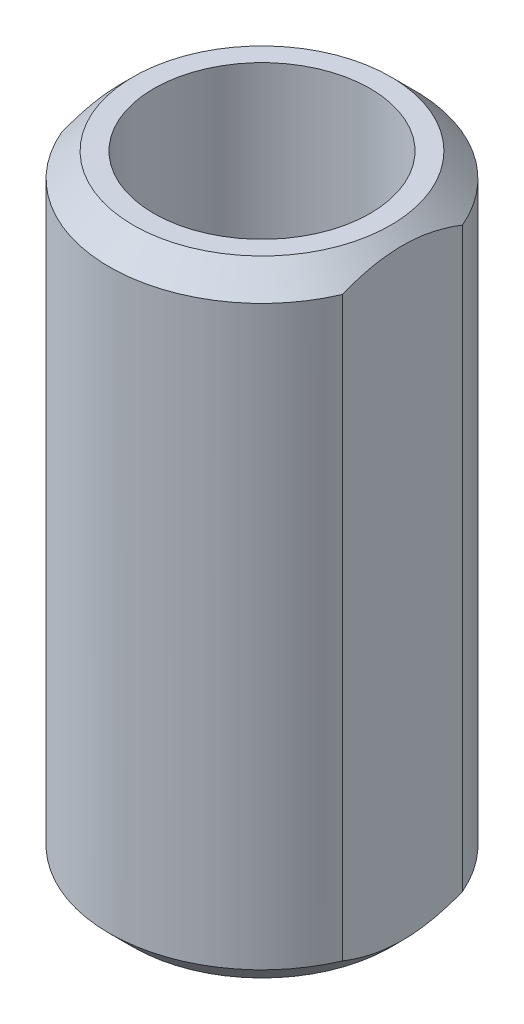
ISO-10303-21;
HEADER;
FILE_DESCRIPTION(('STEP AP214'),'2;1');
FILE_NAME('part.step','',(''),(''),'','','');
FILE_SCHEMA(('AUTOMOTIVE_DESIGN { 1 0 10303 214 1 1 1 1 }'));
ENDSEC;
DATA;
#1=APPLICATION_CONTEXT('core data for automotive mechanical design processes');
#2=APPLICATION_PROTOCOL_DEFINITION('international standard','automotive_design',2000,#1);
#3=PRODUCT_CONTEXT('',#1,'mechanical');
#4=PRODUCT('Part','Part','',(#3));
#5=PRODUCT_RELATED_PRODUCT_CATEGORY('part','',(#4));
#6=PRODUCT_DEFINITION_FORMATION('','',#4);
#7=PRODUCT_DEFINITION_CONTEXT('part definition',#1,'design');
#8=PRODUCT_DEFINITION('design','',#6,#7);
#9=PRODUCT_DEFINITION_SHAPE('','',#8);
#10=(LENGTH_UNIT() NAMED_UNIT(*) SI_UNIT(.MILLI.,.METRE.));
#11=(NAMED_UNIT(*) PLANE_ANGLE_UNIT() SI_UNIT($,.RADIAN.));
#12=(NAMED_UNIT(*) SI_UNIT($,.STERADIAN.) SOLID_ANGLE_UNIT());
#13=UNCERTAINTY_MEASURE_WITH_UNIT(LENGTH_MEASURE(1.E-05),#10,'distance_accuracy_value','');
#14=(GEOMETRIC_REPRESENTATION_CONTEXT(3) GLOBAL_UNCERTAINTY_ASSIGNED_CONTEXT((#13)) GLOBAL_UNIT_ASSIGNED_CONTEXT((#10,
#11,#12)) REPRESENTATION_CONTEXT('',''));
#15=CARTESIAN_POINT('',(0.,0.,0.));
#16=DIRECTION('',(0.,0.,1.));
#17=DIRECTION('',(1.,0.,0.));
#18=AXIS2_PLACEMENT_3D('',#15,#16,#17);
#19=CARTESIAN_POINT('',(0.,18.0166273584906,0.));
#20=DIRECTION('',(0.,1.,0.));
#21=DIRECTION('',(0.,0.,1.));
#22=AXIS2_PLACEMENT_3D('',#19,#20,#21);
#23=CYLINDRICAL_SURFACE('',#22,6.35);
#24=DIRECTION('',(0.,1.,0.));
#25=VECTOR('',#24,1.);
#26=CARTESIAN_POINT('',(5.83716540796986,-13.,2.5));
#27=LINE('',#26,#25);
#28=CARTESIAN_POINT('',(5.83716540796986,-12.,2.5));
#29=VERTEX_POINT('',#28);
#30=CARTESIAN_POINT('',(5.83716540796986,12.,2.5));
#31=VERTEX_POINT('',#30);
#32=EDGE_CURVE('E79',#29,#31,#27,.T.);
#33=ORIENTED_EDGE('',*,*,#32,.T.);
#34=CARTESIAN_POINT('',(0.,12.,0.));
#35=DIRECTION('',(0.,1.,0.));
#36=DIRECTION('',(0.,0.,1.));
#37=AXIS2_PLACEMENT_3D('',#34,#35,#36);
#38=CIRCLE('',#37,6.35);
#39=CARTESIAN_POINT('',(-5.83716540796986,12.,2.5));
#40=VERTEX_POINT('',#39);
#41=EDGE_CURVE('E157',#40,#31,#38,.T.);
#42=ORIENTED_EDGE('',*,*,#41,.F.);
#43=DIRECTION('',(0.,1.,0.));
#44=VECTOR('',#43,1.);
#45=CARTESIAN_POINT('',(-5.83716540796986,-13.,2.5));
#46=LINE('',#45,#44);
#47=CARTESIAN_POINT('',(-5.83716540796986,-12.,2.5));
#48=VERTEX_POINT('',#47);
#49=EDGE_CURVE('E62',#48,#40,#46,.T.);
#50=ORIENTED_EDGE('',*,*,#49,.F.);
#51=CARTESIAN_POINT('',(0.,-12.,0.));
#52=DIRECTION('',(0.,1.,0.));
#53=DIRECTION('',(0.,0.,1.));
#54=AXIS2_PLACEMENT_3D('',#51,#52,#53);
#55=CIRCLE('',#54,6.34999999999999);
#56=EDGE_CURVE('E94',#48,#29,#55,.T.);
#57=ORIENTED_EDGE('',*,*,#56,.T.);
#58=EDGE_LOOP('',(#33,#42,#50,#57));
#59=FACE_BOUND('',#58,.T.);
#60=ADVANCED_FACE('F35',(#59),#23,.T.);
#61=DIRECTION('',(0.,1.,0.));
#62=VECTOR('',#61,1.);
#63=CARTESIAN_POINT('',(5.83716540796986,-13.,-2.5));
#64=LINE('',#63,#62);
#65=CARTESIAN_POINT('',(5.83716540796986,-12.,-2.5));
#66=VERTEX_POINT('',#65);
#67=CARTESIAN_POINT('',(5.83716540796986,12.,-2.5));
#68=VERTEX_POINT('',#67);
#69=EDGE_CURVE('E54',#66,#68,#64,.T.);
#70=ORIENTED_EDGE('',*,*,#69,.F.);
#71=CARTESIAN_POINT('',(-5.83716540796986,-12.,-2.5));
#72=VERTEX_POINT('',#71);
#73=EDGE_CURVE('E95',#66,#72,#55,.T.);
#74=ORIENTED_EDGE('',*,*,#73,.T.);
#75=DIRECTION('',(0.,1.,0.));
#76=VECTOR('',#75,1.);
#77=CARTESIAN_POINT('',(-5.83716540796986,-13.,-2.5));
#78=LINE('',#77,#76);
#79=CARTESIAN_POINT('',(-5.83716540796986,12.,-2.5));
#80=VERTEX_POINT('',#79);
#81=EDGE_CURVE('E139',#72,#80,#78,.T.);
#82=ORIENTED_EDGE('',*,*,#81,.T.);
#83=EDGE_CURVE('E156',#68,#80,#38,.T.);
#84=ORIENTED_EDGE('',*,*,#83,.F.);
#85=EDGE_LOOP('',(#70,#74,#82,#84));
#86=FACE_BOUND('',#85,.T.);
#87=ADVANCED_FACE('F37',(#86),#23,.T.);
#88=CARTESIAN_POINT('',(0.,-12.,0.));
#89=DIRECTION('',(0.,1.,0.));
#90=DIRECTION('',(0.,0.,1.));
#91=AXIS2_PLACEMENT_3D('',#88,#89,#90);
#92=CONICAL_SURFACE('',#91,6.34999999999999,0.785398163397447);
#93=CARTESIAN_POINT('',(5.83716540796986,-10.4428835649028,-5.33385323365611));
#94=CARTESIAN_POINT('',(5.83716540796986,-10.5339050872247,-5.19889026361435));
#95=CARTESIAN_POINT('',(5.83716540796986,-10.6236655171933,-5.06306159493966));
#96=CARTESIAN_POINT('',(5.83716540796986,-10.8001739022309,-4.78940419524437));
#97=CARTESIAN_POINT('',(5.83716540796986,-10.8869209239487,-4.65157486296787));
#98=CARTESIAN_POINT('',(5.83716540796986,-11.0574434554421,-4.37276903991061));
#99=CARTESIAN_POINT('',(5.83716540796986,-11.1411942578975,-4.23177737378041));
#100=CARTESIAN_POINT('',(5.83716540796986,-11.3044032760383,-3.94734175148071));
#101=CARTESIAN_POINT('',(5.83716540796986,-11.383861838721,-3.80389799478344));
#102=CARTESIAN_POINT('',(5.83716540796986,-11.5399838140063,-3.5099547338051));
#103=CARTESIAN_POINT('',(5.83716540796986,-11.6164928823948,-3.35937244902487));
#104=CARTESIAN_POINT('',(5.83716540796986,-11.7630224057286,-3.05508878819343));
#105=CARTESIAN_POINT('',(5.83716540796986,-11.8330419513664,-2.9013869787035));
#106=CARTESIAN_POINT('',(5.83716540796986,-12.0310998396831,-2.43609722627272));
#107=CARTESIAN_POINT('',(5.83716540796986,-12.1476852724677,-2.11932746233414));
#108=CARTESIAN_POINT('',(5.83716540796986,-12.2855179072159,-1.65069683990229));
#109=CARTESIAN_POINT('',(5.83716540796986,-12.3239593177784,-1.50381776285013));
#110=CARTESIAN_POINT('',(5.83716540796986,-12.3909392466395,-1.20776045311896));
#111=CARTESIAN_POINT('',(5.83716540796986,-12.4194764795135,-1.05858192462524));
#112=CARTESIAN_POINT('',(5.83716540796986,-12.4653745784528,-0.760139408649969));
#113=CARTESIAN_POINT('',(5.83716540796986,-12.4828521069321,-0.610893521457408));
#114=CARTESIAN_POINT('',(5.83716540796986,-12.5064339532868,-0.311506055406552));
#115=CARTESIAN_POINT('',(5.83716540796986,-12.5125387269292,-0.161364512683871));
#116=CARTESIAN_POINT('',(5.83716540796986,-12.5131623695768,0.167089963449245));
#117=CARTESIAN_POINT('',(5.83716540796986,-12.5052970184498,0.345412205219306));
#118=CARTESIAN_POINT('',(5.83716540796986,-12.4736016136142,0.700636212510622));
#119=CARTESIAN_POINT('',(5.83716540796986,-12.4497682854614,0.877537679152109));
#120=CARTESIAN_POINT('',(5.83716540796986,-12.3869976738989,1.2310940975592));
#121=CARTESIAN_POINT('',(5.83716540796986,-12.3478588435338,1.40771278733274));
#122=CARTESIAN_POINT('',(5.83716540796986,-12.2563561402393,1.7574120387144));
#123=CARTESIAN_POINT('',(5.83716540796986,-12.2039942485811,1.93049312618158));
#124=CARTESIAN_POINT('',(5.83716540796986,-12.0819171921497,2.29086766178252));
#125=CARTESIAN_POINT('',(5.83716540796986,-12.0109542331893,2.47773469773681));
#126=CARTESIAN_POINT('',(5.83716540796986,-11.8577890816967,2.84684492308895));
#127=CARTESIAN_POINT('',(5.83716540796986,-11.7755819659656,3.02908604538355));
#128=CARTESIAN_POINT('',(5.83716540796986,-11.6018310698761,3.38973967886332));
#129=CARTESIAN_POINT('',(5.83716540796986,-11.5102585023215,3.56813821294766));
#130=CARTESIAN_POINT('',(5.83716540796986,-11.3197768395795,3.92091510631394));
#131=CARTESIAN_POINT('',(5.83716540796986,-11.2208688191781,4.09529404965531));
#132=CARTESIAN_POINT('',(5.83716540796986,-11.0213286587285,4.43336866034776));
#133=CARTESIAN_POINT('',(5.83716540796986,-10.9209379137322,4.59720755004418));
#134=CARTESIAN_POINT('',(5.83716540796986,-10.71565451351,4.92204912814633));
#135=CARTESIAN_POINT('',(5.83716540796986,-10.6107615049465,5.08305159254567));
#136=CARTESIAN_POINT('',(5.83716540796986,-10.3981074001831,5.40129843587903));
#137=CARTESIAN_POINT('',(5.83716540796986,-10.2903756432904,5.5585624915905));
#138=CARTESIAN_POINT('',(5.83716540796986,-10.0718628720387,5.87089289445958));
#139=CARTESIAN_POINT('',(5.83716540796986,-9.96108274426627,6.02595986115073));
#140=CARTESIAN_POINT('',(5.83716540796986,-9.84905050566139,6.18010050931986));
#141=B_SPLINE_CURVE_WITH_KNOTS('',3,(#93,#94,#95,#96,#97,#98,#99,#100,#101,#102,#103,#104,#105,
#106,#107,#108,#109,#110,#111,#112,#113,#114,#115,#116,#117,#118,#119,#120,#121,#122,#123,#124,
#125,#126,#127,#128,#129,#130,#131,#132,#133,#134,#135,#136,#137,#138,#139,#140),.UNSPECIFIED.,
.F.,.F.,(4,2,2,2,2,2,2,2,2,2,2,2,2,2,2,2,2,2,2,2,2,2,2,4),(0.,0.488375243493426,
0.976900427992977,1.46880508904934,1.96066992337915,2.4672240737933,2.97384909525919,
3.98369571593602,4.43890448586771,4.89417231349768,5.34455401525144,5.79491766742156,
6.32963497895746,6.86446197489871,7.40658264888771,7.94862214262927,8.54783174587401,
9.14730455499117,9.74867878506822,10.3499650755844,10.9263282811041,11.5027368026219,
12.07457450812,12.646247622713),.UNSPECIFIED.);
#142=EDGE_CURVE('E82',#29,#66,#141,.F.);
#143=ORIENTED_EDGE('',*,*,#142,.F.);
#144=ORIENTED_EDGE('',*,*,#56,.F.);
#145=CARTESIAN_POINT('',(-5.83716540796986,-10.4428835649028,-5.33385323365611));
#146=CARTESIAN_POINT('',(-5.83716540796986,-10.5339050872247,-5.19889026361435));
#147=CARTESIAN_POINT('',(-5.83716540796986,-10.6236655171933,-5.06306159493966));
#148=CARTESIAN_POINT('',(-5.83716540796986,-10.8001739022309,-4.78940419524437));
#149=CARTESIAN_POINT('',(-5.83716540796986,-10.8869209239487,-4.65157486296787));
#150=CARTESIAN_POINT('',(-5.83716540796986,-11.0574434554421,-4.37276903991061));
#151=CARTESIAN_POINT('',(-5.83716540796986,-11.1411942578975,-4.23177737378041));
#152=CARTESIAN_POINT('',(-5.83716540796986,-11.3044032760383,-3.94734175148071));
#153=CARTESIAN_POINT('',(-5.83716540796986,-11.383861838721,-3.80389799478344));
#154=CARTESIAN_POINT('',(-5.83716540796986,-11.5399838140063,-3.5099547338051));
#155=CARTESIAN_POINT('',(-5.83716540796986,-11.6164928823948,-3.35937244902487));
#156=CARTESIAN_POINT('',(-5.83716540796986,-11.7630224057286,-3.05508878819343));
#157=CARTESIAN_POINT('',(-5.83716540796986,-11.8330419513664,-2.9013869787035));
#158=CARTESIAN_POINT('',(-5.83716540796986,-12.0310998396831,-2.43609722627272));
#159=CARTESIAN_POINT('',(-5.83716540796986,-12.1476852724677,-2.11932746233414));
#160=CARTESIAN_POINT('',(-5.83716540796986,-12.2855179072159,-1.65069683990229));
#161=CARTESIAN_POINT('',(-5.83716540796986,-12.3239593177784,-1.50381776285013));
#162=CARTESIAN_POINT('',(-5.83716540796986,-12.3909392466395,-1.20776045311896));
#163=CARTESIAN_POINT('',(-5.83716540796986,-12.4194764795135,-1.05858192462524));
#164=CARTESIAN_POINT('',(-5.83716540796986,-12.4653745784528,-0.760139408649969));
#165=CARTESIAN_POINT('',(-5.83716540796986,-12.4828521069321,-0.610893521457408));
#166=CARTESIAN_POINT('',(-5.83716540796986,-12.5064339532868,-0.311506055406552));
#167=CARTESIAN_POINT('',(-5.83716540796986,-12.5125387269292,-0.161364512683871));
#168=CARTESIAN_POINT('',(-5.83716540796986,-12.5131623695768,0.167089963449245));
#169=CARTESIAN_POINT('',(-5.83716540796986,-12.5052970184498,0.345412205219306));
#170=CARTESIAN_POINT('',(-5.83716540796986,-12.4736016136142,0.700636212510622));
#171=CARTESIAN_POINT('',(-5.83716540796986,-12.4497682854614,0.877537679152109));
#172=CARTESIAN_POINT('',(-5.83716540796986,-12.3869976738989,1.2310940975592));
#173=CARTESIAN_POINT('',(-5.83716540796986,-12.3478588435338,1.40771278733274));
#174=CARTESIAN_POINT('',(-5.83716540796986,-12.2563561402393,1.7574120387144));
#175=CARTESIAN_POINT('',(-5.83716540796986,-12.2039942485811,1.93049312618158));
#176=CARTESIAN_POINT('',(-5.83716540796986,-12.0819171921497,2.29086766178252));
#177=CARTESIAN_POINT('',(-5.83716540796986,-12.0109542331893,2.47773469773681));
#178=CARTESIAN_POINT('',(-5.83716540796986,-11.8577890816967,2.84684492308895));
#179=CARTESIAN_POINT('',(-5.83716540796986,-11.7755819659656,3.02908604538355));
#180=CARTESIAN_POINT('',(-5.83716540796986,-11.6018310698761,3.38973967886332));
#181=CARTESIAN_POINT('',(-5.83716540796986,-11.5102585023215,3.56813821294766));
#182=CARTESIAN_POINT('',(-5.83716540796986,-11.3197768395795,3.92091510631394));
#183=CARTESIAN_POINT('',(-5.83716540796986,-11.2208688191781,4.09529404965531));
#184=CARTESIAN_POINT('',(-5.83716540796986,-11.0213286587285,4.43336866034776));
#185=CARTESIAN_POINT('',(-5.83716540796986,-10.9209379137322,4.59720755004418));
#186=CARTESIAN_POINT('',(-5.83716540796986,-10.71565451351,4.92204912814633));
#187=CARTESIAN_POINT('',(-5.83716540796986,-10.6107615049465,5.08305159254567));
#188=CARTESIAN_POINT('',(-5.83716540796986,-10.3981074001831,5.40129843587903));
#189=CARTESIAN_POINT('',(-5.83716540796986,-10.2903756432904,5.5585624915905));
#190=CARTESIAN_POINT('',(-5.83716540796986,-10.0718628720387,5.87089289445958));
#191=CARTESIAN_POINT('',(-5.83716540796986,-9.96108274426627,6.02595986115073));
#192=CARTESIAN_POINT('',(-5.83716540796986,-9.84905050566139,6.18010050931986));
#193=B_SPLINE_CURVE_WITH_KNOTS('',3,(#145,#146,#147,#148,#149,#150,#151,#152,#153,#154,#155,
#156,#157,#158,#159,#160,#161,#162,#163,#164,#165,#166,#167,#168,#169,#170,#171,#172,#173,#174,
#175,#176,#177,#178,#179,#180,#181,#182,#183,#184,#185,#186,#187,#188,#189,#190,#191,#192),
.UNSPECIFIED.,.F.,.F.,(4,2,2,2,2,2,2,2,2,2,2,2,2,2,2,2,2,2,2,2,2,2,2,4),(0.,0.488375243493426,
0.976900427992977,1.46880508904934,1.96066992337915,2.4672240737933,2.97384909525919,
3.98369571593602,4.43890448586771,4.89417231349768,5.34455401525144,5.79491766742156,
6.32963497895746,6.86446197489871,7.40658264888771,7.94862214262927,8.54783174587401,
9.14730455499117,9.74867878506822,10.3499650755844,10.9263282811041,11.5027368026219,
12.07457450812,12.646247622713),.UNSPECIFIED.);
#194=EDGE_CURVE('E128',#72,#48,#193,.T.);
#195=ORIENTED_EDGE('',*,*,#194,.F.);
#196=ORIENTED_EDGE('',*,*,#73,.F.);
#197=EDGE_LOOP('',(#143,#144,#195,#196));
#198=FACE_BOUND('',#197,.T.);
#199=CARTESIAN_POINT('',(0.,-13.,0.));
#200=DIRECTION('',(0.,1.,0.));
#201=DIRECTION('',(0.,0.,1.));
#202=AXIS2_PLACEMENT_3D('',#199,#200,#201);
#203=CIRCLE('',#202,5.35);
#204=CARTESIAN_POINT('',(0.,-13.,5.35));
#205=VERTEX_POINT('',#204);
#206=EDGE_CURVE('E98',#205,#205,#203,.T.);
#207=ORIENTED_EDGE('',*,*,#206,.T.);
#208=EDGE_LOOP('',(#207));
#209=FACE_BOUND('',#208,.T.);
#210=ADVANCED_FACE('F91',(#198,#209),#92,.T.);
#211=CARTESIAN_POINT('',(0.,-13.,0.));
#212=DIRECTION('',(0.,-1.,0.));
#213=DIRECTION('',(0.,0.,-1.));
#214=AXIS2_PLACEMENT_3D('',#211,#212,#213);
#215=PLANE('',#214);
#216=CARTESIAN_POINT('',(0.,-13.,0.));
#217=DIRECTION('',(0.,1.,0.));
#218=DIRECTION('',(0.,0.,1.));
#219=AXIS2_PLACEMENT_3D('',#216,#217,#218);
#220=CIRCLE('',#219,4.5);
#221=CARTESIAN_POINT('',(0.,-13.,4.5));
#222=VERTEX_POINT('',#221);
#223=EDGE_CURVE('E164',#222,#222,#220,.T.);
#224=ORIENTED_EDGE('',*,*,#223,.T.);
#225=EDGE_LOOP('',(#224));
#226=FACE_BOUND('',#225,.T.);
#227=ORIENTED_EDGE('',*,*,#206,.F.);
#228=EDGE_LOOP('',(#227));
#229=FACE_BOUND('',#228,.T.);
#230=ADVANCED_FACE('F120',(#226,#229),#215,.T.);
#231=CARTESIAN_POINT('',(0.,18.0166273584906,0.));
#232=DIRECTION('',(0.,1.,0.));
#233=DIRECTION('',(0.,0.,1.));
#234=AXIS2_PLACEMENT_3D('',#231,#232,#233);
#235=CYLINDRICAL_SURFACE('',#234,4.5);
#236=CARTESIAN_POINT('',(0.,13.,0.));
#237=DIRECTION('',(0.,1.,0.));
#238=DIRECTION('',(0.,0.,1.));
#239=AXIS2_PLACEMENT_3D('',#236,#237,#238);
#240=CIRCLE('',#239,4.5);
#241=CARTESIAN_POINT('',(0.,13.,4.5));
#242=VERTEX_POINT('',#241);
#243=EDGE_CURVE('E162',#242,#242,#240,.T.);
#244=ORIENTED_EDGE('',*,*,#243,.T.);
#245=EDGE_LOOP('',(#244));
#246=FACE_BOUND('',#245,.T.);
#247=ORIENTED_EDGE('',*,*,#223,.F.);
#248=EDGE_LOOP('',(#247));
#249=FACE_BOUND('',#248,.T.);
#250=ADVANCED_FACE('F116',(#246,#249),#235,.F.);
#251=CARTESIAN_POINT('',(0.,13.,0.));
#252=DIRECTION('',(0.,1.,0.));
#253=DIRECTION('',(0.,0.,1.));
#254=AXIS2_PLACEMENT_3D('',#251,#252,#253);
#255=PLANE('',#254);
#256=CARTESIAN_POINT('',(0.,13.,0.));
#257=DIRECTION('',(0.,1.,0.));
#258=DIRECTION('',(0.,0.,1.));
#259=AXIS2_PLACEMENT_3D('',#256,#257,#258);
#260=CIRCLE('',#259,5.35);
#261=CARTESIAN_POINT('',(0.,13.,5.35));
#262=VERTEX_POINT('',#261);
#263=EDGE_CURVE('E158',#262,#262,#260,.T.);
#264=ORIENTED_EDGE('',*,*,#263,.T.);
#265=EDGE_LOOP('',(#264));
#266=FACE_BOUND('',#265,.T.);
#267=ORIENTED_EDGE('',*,*,#243,.F.);
#268=EDGE_LOOP('',(#267));
#269=FACE_BOUND('',#268,.T.);
#270=ADVANCED_FACE('F111',(#266,#269),#255,.T.);
#271=CARTESIAN_POINT('',(0.,13.,0.));
#272=DIRECTION('',(0.,-1.,0.));
#273=DIRECTION('',(0.,0.,-1.));
#274=AXIS2_PLACEMENT_3D('',#271,#272,#273);
#275=CONICAL_SURFACE('',#274,5.35,0.785398163397447);
#276=CARTESIAN_POINT('',(5.83716540796986,10.4428835649028,-5.33385323365612));
#277=CARTESIAN_POINT('',(5.83716540796986,10.5339050872247,-5.19889026361435));
#278=CARTESIAN_POINT('',(5.83716540796986,10.6236655171933,-5.06306159493966));
#279=CARTESIAN_POINT('',(5.83716540796986,10.8001739022309,-4.78940419524438));
#280=CARTESIAN_POINT('',(5.83716540796986,10.8869209239487,-4.65157486296787));
#281=CARTESIAN_POINT('',(5.83716540796986,11.0574434554421,-4.37276903991062));
#282=CARTESIAN_POINT('',(5.83716540796986,11.1411942578975,-4.23177737378041));
#283=CARTESIAN_POINT('',(5.83716540796986,11.3044032760383,-3.94734175148072));
#284=CARTESIAN_POINT('',(5.83716540796986,11.383861838721,-3.80389799478345));
#285=CARTESIAN_POINT('',(5.83716540796986,11.5399838140063,-3.5099547338051));
#286=CARTESIAN_POINT('',(5.83716540796986,11.6164928823948,-3.35937244902487));
#287=CARTESIAN_POINT('',(5.83716540796986,11.7630224057286,-3.05508878819344));
#288=CARTESIAN_POINT('',(5.83716540796986,11.8330419513664,-2.9013869787035));
#289=CARTESIAN_POINT('',(5.83716540796986,12.0310998396831,-2.43609722627272));
#290=CARTESIAN_POINT('',(5.83716540796986,12.1476852724677,-2.11932746233415));
#291=CARTESIAN_POINT('',(5.83716540796986,12.2855179072159,-1.65069683990229));
#292=CARTESIAN_POINT('',(5.83716540796986,12.3239593177784,-1.50381776285013));
#293=CARTESIAN_POINT('',(5.83716540796986,12.3909392466395,-1.20776045311896));
#294=CARTESIAN_POINT('',(5.83716540796986,12.4194764795135,-1.05858192462524));
#295=CARTESIAN_POINT('',(5.83716540796986,12.4653745784528,-0.760139408649971));
#296=CARTESIAN_POINT('',(5.83716540796986,12.4828521069321,-0.61089352145741));
#297=CARTESIAN_POINT('',(5.83716540796986,12.5064339532868,-0.311506055406554));
#298=CARTESIAN_POINT('',(5.83716540796986,12.5125387269292,-0.161364512683873));
#299=CARTESIAN_POINT('',(5.83716540796986,12.5131623695768,0.167089963449242));
#300=CARTESIAN_POINT('',(5.83716540796986,12.5052970184498,0.345412205219304));
#301=CARTESIAN_POINT('',(5.83716540796986,12.4736016136142,0.700636212510621));
#302=CARTESIAN_POINT('',(5.83716540796986,12.4497682854614,0.877537679152108));
#303=CARTESIAN_POINT('',(5.83716540796986,12.3869976738989,1.2310940975592));
#304=CARTESIAN_POINT('',(5.83716540796986,12.3478588435338,1.40771278733274));
#305=CARTESIAN_POINT('',(5.83716540796986,12.2563561402393,1.7574120387144));
#306=CARTESIAN_POINT('',(5.83716540796986,12.2039942485811,1.93049312618158));
#307=CARTESIAN_POINT('',(5.83716540796986,12.0819171921497,2.29086766178252));
#308=CARTESIAN_POINT('',(5.83716540796986,12.0109542331893,2.47773469773681));
#309=CARTESIAN_POINT('',(5.83716540796986,11.8577890816967,2.84684492308895));
#310=CARTESIAN_POINT('',(5.83716540796986,11.7755819659656,3.02908604538356));
#311=CARTESIAN_POINT('',(5.83716540796986,11.6018310698761,3.38973967886332));
#312=CARTESIAN_POINT('',(5.83716540796986,11.5102585023215,3.56813821294767));
#313=CARTESIAN_POINT('',(5.83716540796986,11.3197768395795,3.92091510631394));
#314=CARTESIAN_POINT('',(5.83716540796986,11.2208688191781,4.09529404965531));
#315=CARTESIAN_POINT('',(5.83716540796986,11.0213286587285,4.43336866034776));
#316=CARTESIAN_POINT('',(5.83716540796986,10.9209379137322,4.59720755004418));
#317=CARTESIAN_POINT('',(5.83716540796986,10.71565451351,4.92204912814633));
#318=CARTESIAN_POINT('',(5.83716540796986,10.6107615049465,5.08305159254567));
#319=CARTESIAN_POINT('',(5.83716540796986,10.3981074001831,5.40129843587903));
#320=CARTESIAN_POINT('',(5.83716540796986,10.2903756432904,5.5585624915905));
#321=CARTESIAN_POINT('',(5.83716540796986,10.0718628720387,5.87089289445959));
#322=CARTESIAN_POINT('',(5.83716540796986,9.96108274426627,6.02595986115074));
#323=CARTESIAN_POINT('',(5.83716540796986,9.84905050566139,6.18010050931987));
#324=B_SPLINE_CURVE_WITH_KNOTS('',3,(#276,#277,#278,#279,#280,#281,#282,#283,#284,#285,#286,
#287,#288,#289,#290,#291,#292,#293,#294,#295,#296,#297,#298,#299,#300,#301,#302,#303,#304,#305,
#306,#307,#308,#309,#310,#311,#312,#313,#314,#315,#316,#317,#318,#319,#320,#321,#322,#323),
.UNSPECIFIED.,.F.,.F.,(4,2,2,2,2,2,2,2,2,2,2,2,2,2,2,2,2,2,2,2,2,2,2,4),(0.,0.488375243493426,
0.976900427992977,1.46880508904934,1.96066992337915,2.4672240737933,2.97384909525919,
3.98369571593603,4.43890448586772,4.89417231349768,5.34455401525144,5.79491766742156,
6.32963497895746,6.86446197489871,7.40658264888771,7.94862214262927,8.54783174587401,
9.14730455499118,9.74867878506823,10.3499650755844,10.9263282811041,11.5027368026219,
12.07457450812,12.646247622713),.UNSPECIFIED.);
#325=EDGE_CURVE('E11',#68,#31,#324,.T.);
#326=ORIENTED_EDGE('',*,*,#325,.F.);
#327=ORIENTED_EDGE('',*,*,#83,.T.);
#328=CARTESIAN_POINT('',(-5.83716540796986,10.4428835649028,-5.33385323365612));
#329=CARTESIAN_POINT('',(-5.83716540796986,10.5339050872247,-5.19889026361435));
#330=CARTESIAN_POINT('',(-5.83716540796986,10.6236655171933,-5.06306159493966));
#331=CARTESIAN_POINT('',(-5.83716540796986,10.8001739022309,-4.78940419524438));
#332=CARTESIAN_POINT('',(-5.83716540796986,10.8869209239487,-4.65157486296787));
#333=CARTESIAN_POINT('',(-5.83716540796986,11.0574434554421,-4.37276903991062));
#334=CARTESIAN_POINT('',(-5.83716540796986,11.1411942578975,-4.23177737378041));
#335=CARTESIAN_POINT('',(-5.83716540796986,11.3044032760383,-3.94734175148072));
#336=CARTESIAN_POINT('',(-5.83716540796986,11.383861838721,-3.80389799478345));
#337=CARTESIAN_POINT('',(-5.83716540796986,11.5399838140063,-3.5099547338051));
#338=CARTESIAN_POINT('',(-5.83716540796986,11.6164928823948,-3.35937244902487));
#339=CARTESIAN_POINT('',(-5.83716540796986,11.7630224057286,-3.05508878819344));
#340=CARTESIAN_POINT('',(-5.83716540796986,11.8330419513664,-2.9013869787035));
#341=CARTESIAN_POINT('',(-5.83716540796986,12.0310998396831,-2.43609722627272));
#342=CARTESIAN_POINT('',(-5.83716540796986,12.1476852724677,-2.11932746233415));
#343=CARTESIAN_POINT('',(-5.83716540796986,12.2855179072159,-1.65069683990229));
#344=CARTESIAN_POINT('',(-5.83716540796986,12.3239593177784,-1.50381776285013));
#345=CARTESIAN_POINT('',(-5.83716540796986,12.3909392466395,-1.20776045311896));
#346=CARTESIAN_POINT('',(-5.83716540796986,12.4194764795135,-1.05858192462524));
#347=CARTESIAN_POINT('',(-5.83716540796986,12.4653745784528,-0.760139408649971));
#348=CARTESIAN_POINT('',(-5.83716540796986,12.4828521069321,-0.61089352145741));
#349=CARTESIAN_POINT('',(-5.83716540796986,12.5064339532868,-0.311506055406554));
#350=CARTESIAN_POINT('',(-5.83716540796986,12.5125387269292,-0.161364512683873));
#351=CARTESIAN_POINT('',(-5.83716540796986,12.5131623695768,0.167089963449242));
#352=CARTESIAN_POINT('',(-5.83716540796986,12.5052970184498,0.345412205219304));
#353=CARTESIAN_POINT('',(-5.83716540796986,12.4736016136142,0.700636212510621));
#354=CARTESIAN_POINT('',(-5.83716540796986,12.4497682854614,0.877537679152108));
#355=CARTESIAN_POINT('',(-5.83716540796986,12.3869976738989,1.2310940975592));
#356=CARTESIAN_POINT('',(-5.83716540796986,12.3478588435338,1.40771278733274));
#357=CARTESIAN_POINT('',(-5.83716540796986,12.2563561402393,1.7574120387144));
#358=CARTESIAN_POINT('',(-5.83716540796986,12.2039942485811,1.93049312618158));
#359=CARTESIAN_POINT('',(-5.83716540796986,12.0819171921497,2.29086766178252));
#360=CARTESIAN_POINT('',(-5.83716540796986,12.0109542331893,2.47773469773681));
#361=CARTESIAN_POINT('',(-5.83716540796986,11.8577890816967,2.84684492308895));
#362=CARTESIAN_POINT('',(-5.83716540796986,11.7755819659656,3.02908604538356));
#363=CARTESIAN_POINT('',(-5.83716540796986,11.6018310698761,3.38973967886332));
#364=CARTESIAN_POINT('',(-5.83716540796986,11.5102585023215,3.56813821294767));
#365=CARTESIAN_POINT('',(-5.83716540796986,11.3197768395795,3.92091510631394));
#366=CARTESIAN_POINT('',(-5.83716540796986,11.2208688191781,4.09529404965531));
#367=CARTESIAN_POINT('',(-5.83716540796986,11.0213286587285,4.43336866034776));
#368=CARTESIAN_POINT('',(-5.83716540796986,10.9209379137322,4.59720755004418));
#369=CARTESIAN_POINT('',(-5.83716540796986,10.71565451351,4.92204912814633));
#370=CARTESIAN_POINT('',(-5.83716540796986,10.6107615049465,5.08305159254567));
#371=CARTESIAN_POINT('',(-5.83716540796986,10.3981074001831,5.40129843587903));
#372=CARTESIAN_POINT('',(-5.83716540796986,10.2903756432904,5.5585624915905));
#373=CARTESIAN_POINT('',(-5.83716540796986,10.0718628720387,5.87089289445959));
#374=CARTESIAN_POINT('',(-5.83716540796986,9.96108274426627,6.02595986115074));
#375=CARTESIAN_POINT('',(-5.83716540796986,9.84905050566139,6.18010050931987));
#376=B_SPLINE_CURVE_WITH_KNOTS('',3,(#328,#329,#330,#331,#332,#333,#334,#335,#336,#337,#338,
#339,#340,#341,#342,#343,#344,#345,#346,#347,#348,#349,#350,#351,#352,#353,#354,#355,#356,#357,
#358,#359,#360,#361,#362,#363,#364,#365,#366,#367,#368,#369,#370,#371,#372,#373,#374,#375),
.UNSPECIFIED.,.F.,.F.,(4,2,2,2,2,2,2,2,2,2,2,2,2,2,2,2,2,2,2,2,2,2,2,4),(0.,0.488375243493426,
0.976900427992977,1.46880508904934,1.96066992337915,2.4672240737933,2.97384909525919,
3.98369571593603,4.43890448586772,4.89417231349768,5.34455401525144,5.79491766742156,
6.32963497895746,6.86446197489871,7.40658264888771,7.94862214262927,8.54783174587401,
9.14730455499118,9.74867878506823,10.3499650755844,10.9263282811041,11.5027368026219,
12.07457450812,12.646247622713),.UNSPECIFIED.);
#377=EDGE_CURVE('E48',#40,#80,#376,.F.);
#378=ORIENTED_EDGE('',*,*,#377,.F.);
#379=ORIENTED_EDGE('',*,*,#41,.T.);
#380=EDGE_LOOP('',(#326,#327,#378,#379));
#381=FACE_BOUND('',#380,.T.);
#382=ORIENTED_EDGE('',*,*,#263,.F.);
#383=EDGE_LOOP('',(#382));
#384=FACE_BOUND('',#383,.T.);
#385=ADVANCED_FACE('F107',(#381,#384),#275,.T.);
#386=CARTESIAN_POINT('',(-5.83716540796986,-13.,-2.5));
#387=DIRECTION('',(1.,0.,0.));
#388=DIRECTION('',(0.,0.,-1.));
#389=AXIS2_PLACEMENT_3D('',#386,#387,#388);
#390=PLANE('',#389);
#391=ORIENTED_EDGE('',*,*,#194,.T.);
#392=ORIENTED_EDGE('',*,*,#49,.T.);
#393=ORIENTED_EDGE('',*,*,#377,.T.);
#394=ORIENTED_EDGE('',*,*,#81,.F.);
#395=EDGE_LOOP('',(#391,#392,#393,#394));
#396=FACE_BOUND('',#395,.T.);
#397=ADVANCED_FACE('F105',(#396),#390,.F.);
#398=CARTESIAN_POINT('',(5.83716540796986,-13.,-2.5));
#399=DIRECTION('',(-1.,0.,0.));
#400=DIRECTION('',(0.,0.,1.));
#401=AXIS2_PLACEMENT_3D('',#398,#399,#400);
#402=PLANE('',#401);
#403=ORIENTED_EDGE('',*,*,#142,.T.);
#404=ORIENTED_EDGE('',*,*,#69,.T.);
#405=ORIENTED_EDGE('',*,*,#325,.T.);
#406=ORIENTED_EDGE('',*,*,#32,.F.);
#407=EDGE_LOOP('',(#403,#404,#405,#406));
#408=FACE_BOUND('',#407,.T.);
#409=ADVANCED_FACE('F81',(#408),#402,.F.);
#410=CLOSED_SHELL('',(#60,#87,#210,#230,#250,#270,#385,#397,#409));
#411=MANIFOLD_SOLID_BREP('B2',#410);
#412=ADVANCED_BREP_SHAPE_REPRESENTATION('',(#18,#411),#14);
#413=SHAPE_DEFINITION_REPRESENTATION(#9,#412);
ENDSEC;
END-ISO-10303-21;
